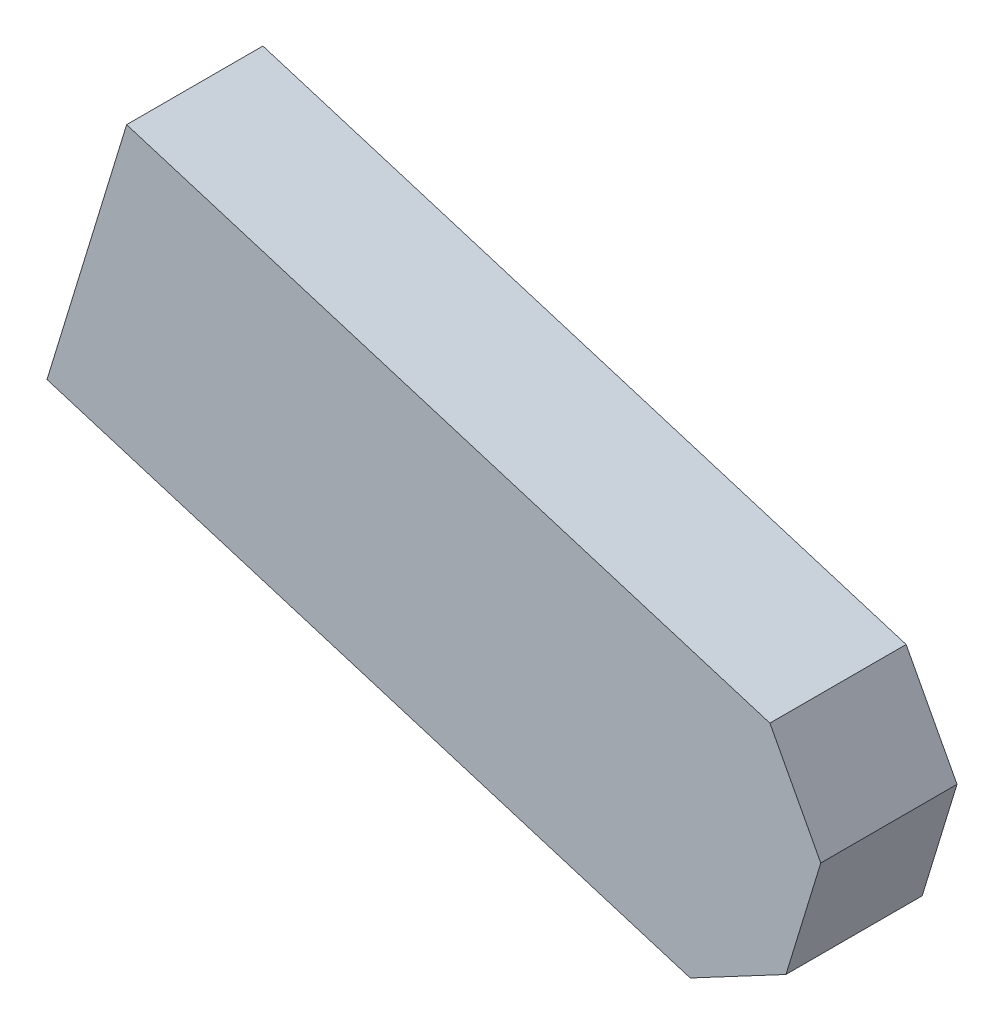
ISO-10303-21;
HEADER;
FILE_DESCRIPTION(('STEP AP214'),'2;1');
FILE_NAME('part.step','',(''),(''),'','','');
FILE_SCHEMA(('AUTOMOTIVE_DESIGN { 1 0 10303 214 1 1 1 1 }'));
ENDSEC;
DATA;
#1=APPLICATION_CONTEXT('core data for automotive mechanical design processes');
#2=APPLICATION_PROTOCOL_DEFINITION('international standard','automotive_design',2000,#1);
#3=PRODUCT_CONTEXT('',#1,'mechanical');
#4=PRODUCT('Part','Part','',(#3));
#5=PRODUCT_RELATED_PRODUCT_CATEGORY('part','',(#4));
#6=PRODUCT_DEFINITION_FORMATION('','',#4);
#7=PRODUCT_DEFINITION_CONTEXT('part definition',#1,'design');
#8=PRODUCT_DEFINITION('design','',#6,#7);
#9=PRODUCT_DEFINITION_SHAPE('','',#8);
#10=(LENGTH_UNIT() NAMED_UNIT(*) SI_UNIT(.MILLI.,.METRE.));
#11=(NAMED_UNIT(*) PLANE_ANGLE_UNIT() SI_UNIT($,.RADIAN.));
#12=(NAMED_UNIT(*) SI_UNIT($,.STERADIAN.) SOLID_ANGLE_UNIT());
#13=UNCERTAINTY_MEASURE_WITH_UNIT(LENGTH_MEASURE(1.E-05),#10,'distance_accuracy_value','');
#14=(GEOMETRIC_REPRESENTATION_CONTEXT(3) GLOBAL_UNCERTAINTY_ASSIGNED_CONTEXT((#13)) GLOBAL_UNIT_ASSIGNED_CONTEXT((#10,
#11,#12)) REPRESENTATION_CONTEXT('',''));
#15=CARTESIAN_POINT('',(0.,0.,0.));
#16=DIRECTION('',(0.,0.,1.));
#17=DIRECTION('',(1.,0.,0.));
#18=AXIS2_PLACEMENT_3D('',#15,#16,#17);
#19=CARTESIAN_POINT('',(-101.950033016076,47.9003211725232,185.));
#20=DIRECTION('',(-0.292371704722769,-0.956304755963026,0.));
#21=DIRECTION('',(-0.956304755963026,0.292371704722769,0.));
#22=AXIS2_PLACEMENT_3D('',#19,#20,#21);
#23=PLANE('',#22);
#24=DIRECTION('',(0.956304755963026,-0.292371704722769,0.));
#25=VECTOR('',#24,1.);
#26=CARTESIAN_POINT('',(-101.950033016076,47.9003211725232,201.));
#27=LINE('',#26,#25);
#28=CARTESIAN_POINT('',(-101.950033016076,47.9003211725231,201.));
#29=VERTEX_POINT('',#28);
#30=CARTESIAN_POINT('',(-26.4019572949981,24.8029564994249,201.));
#31=VERTEX_POINT('',#30);
#32=EDGE_CURVE('E133',#29,#31,#27,.T.);
#33=ORIENTED_EDGE('',*,*,#32,.T.);
#34=DIRECTION('',(0.,0.,1.));
#35=VECTOR('',#34,1.);
#36=CARTESIAN_POINT('',(-26.4019572949981,24.8029564994249,185.));
#37=LINE('',#36,#35);
#38=CARTESIAN_POINT('',(-26.4019572949981,24.8029564994249,185.));
#39=VERTEX_POINT('',#38);
#40=EDGE_CURVE('E11',#39,#31,#37,.T.);
#41=ORIENTED_EDGE('',*,*,#40,.F.);
#42=DIRECTION('',(0.956304755963026,-0.292371704722769,0.));
#43=VECTOR('',#42,1.);
#44=CARTESIAN_POINT('',(-101.950033016076,47.9003211725232,185.));
#45=LINE('',#44,#43);
#46=CARTESIAN_POINT('',(-101.950033016076,47.9003211725231,185.));
#47=VERTEX_POINT('',#46);
#48=EDGE_CURVE('E126',#47,#39,#45,.T.);
#49=ORIENTED_EDGE('',*,*,#48,.F.);
#50=DIRECTION('',(0.,0.,1.));
#51=VECTOR('',#50,1.);
#52=CARTESIAN_POINT('',(-101.950033016076,47.9003211725231,185.));
#53=LINE('',#52,#51);
#54=EDGE_CURVE('E122',#47,#29,#53,.T.);
#55=ORIENTED_EDGE('',*,*,#54,.T.);
#56=EDGE_LOOP('',(#33,#41,#49,#55));
#57=FACE_BOUND('',#56,.T.);
#58=ADVANCED_FACE('F18',(#57),#23,.F.);
#59=CARTESIAN_POINT('',(-26.4019572949981,24.8029564994249,185.));
#60=DIRECTION('',(-0.882947592859036,-0.469471562785685,0.));
#61=DIRECTION('',(-0.469471562785685,0.882947592859036,0.));
#62=AXIS2_PLACEMENT_3D('',#59,#60,#61);
#63=PLANE('',#62);
#64=DIRECTION('',(0.469471562785685,-0.882947592859036,0.));
#65=VECTOR('',#64,1.);
#66=CARTESIAN_POINT('',(-26.4019572949981,24.8029564994249,201.));
#67=LINE('',#66,#65);
#68=CARTESIAN_POINT('',(-20.4265598338377,13.5648683532511,201.));
#69=VERTEX_POINT('',#68);
#70=EDGE_CURVE('E129',#31,#69,#67,.T.);
#71=ORIENTED_EDGE('',*,*,#70,.T.);
#72=DIRECTION('',(0.,0.,1.));
#73=VECTOR('',#72,1.);
#74=CARTESIAN_POINT('',(-20.4265598338378,13.5648683532511,185.));
#75=LINE('',#74,#73);
#76=CARTESIAN_POINT('',(-20.4265598338378,13.5648683532511,185.));
#77=VERTEX_POINT('',#76);
#78=EDGE_CURVE('E27',#77,#69,#75,.T.);
#79=ORIENTED_EDGE('',*,*,#78,.F.);
#80=DIRECTION('',(0.469471562785685,-0.882947592859036,0.));
#81=VECTOR('',#80,1.);
#82=CARTESIAN_POINT('',(-26.4019572949981,24.8029564994249,185.));
#83=LINE('',#82,#81);
#84=EDGE_CURVE('E87',#39,#77,#83,.T.);
#85=ORIENTED_EDGE('',*,*,#84,.F.);
#86=ORIENTED_EDGE('',*,*,#40,.T.);
#87=EDGE_LOOP('',(#71,#79,#85,#86));
#88=FACE_BOUND('',#87,.T.);
#89=ADVANCED_FACE('F173',(#88),#63,.F.);
#90=CARTESIAN_POINT('',(-20.4265598338378,13.5648683532511,185.));
#91=DIRECTION('',(-0.956304755962999,0.292371704722856,0.));
#92=DIRECTION('',(0.292371704722856,0.956304755962999,0.));
#93=AXIS2_PLACEMENT_3D('',#90,#91,#92);
#94=PLANE('',#93);
#95=DIRECTION('',(-0.292371704722855,-0.956304755962999,0.));
#96=VECTOR('',#95,1.);
#97=CARTESIAN_POINT('',(-20.4265598338378,13.5648683532511,201.));
#98=LINE('',#97,#96);
#99=CARTESIAN_POINT('',(-24.5197636999577,0.176601769768997,201.));
#100=VERTEX_POINT('',#99);
#101=EDGE_CURVE('E132',#69,#100,#98,.T.);
#102=ORIENTED_EDGE('',*,*,#101,.T.);
#103=DIRECTION('',(0.,0.,1.));
#104=VECTOR('',#103,1.);
#105=CARTESIAN_POINT('',(-24.5197636999577,0.176601769769,185.));
#106=LINE('',#105,#104);
#107=CARTESIAN_POINT('',(-24.5197636999577,0.176601769769,185.));
#108=VERTEX_POINT('',#107);
#109=EDGE_CURVE('E114',#108,#100,#106,.T.);
#110=ORIENTED_EDGE('',*,*,#109,.F.);
#111=DIRECTION('',(-0.292371704722855,-0.956304755962999,0.));
#112=VECTOR('',#111,1.);
#113=CARTESIAN_POINT('',(-20.4265598338378,13.5648683532511,185.));
#114=LINE('',#113,#112);
#115=EDGE_CURVE('E103',#77,#108,#114,.T.);
#116=ORIENTED_EDGE('',*,*,#115,.F.);
#117=ORIENTED_EDGE('',*,*,#78,.T.);
#118=EDGE_LOOP('',(#102,#110,#116,#117));
#119=FACE_BOUND('',#118,.T.);
#120=ADVANCED_FACE('F154',(#119),#94,.F.);
#121=CARTESIAN_POINT('',(-24.5197636999577,0.176601769769,185.));
#122=DIRECTION('',(-0.469471562785981,0.882947592858879,0.));
#123=DIRECTION('',(0.882947592858879,0.469471562785981,0.));
#124=AXIS2_PLACEMENT_3D('',#121,#122,#123);
#125=PLANE('',#124);
#126=DIRECTION('',(-0.882947592858879,-0.469471562785981,0.));
#127=VECTOR('',#126,1.);
#128=CARTESIAN_POINT('',(-24.5197636999577,0.176601769768997,201.));
#129=LINE('',#128,#127);
#130=CARTESIAN_POINT('',(-35.7578518461286,-5.79879569139457,201.));
#131=VERTEX_POINT('',#130);
#132=EDGE_CURVE('E112',#100,#131,#129,.T.);
#133=ORIENTED_EDGE('',*,*,#132,.T.);
#134=DIRECTION('',(0.,0.,1.));
#135=VECTOR('',#134,1.);
#136=CARTESIAN_POINT('',(-35.7578518461286,-5.79879569139457,185.));
#137=LINE('',#136,#135);
#138=CARTESIAN_POINT('',(-35.7578518461286,-5.79879569139457,185.));
#139=VERTEX_POINT('',#138);
#140=EDGE_CURVE('E109',#139,#131,#137,.T.);
#141=ORIENTED_EDGE('',*,*,#140,.F.);
#142=DIRECTION('',(-0.882947592858879,-0.469471562785981,0.));
#143=VECTOR('',#142,1.);
#144=CARTESIAN_POINT('',(-24.5197636999577,0.176601769769,185.));
#145=LINE('',#144,#143);
#146=EDGE_CURVE('E97',#108,#139,#145,.T.);
#147=ORIENTED_EDGE('',*,*,#146,.F.);
#148=ORIENTED_EDGE('',*,*,#109,.T.);
#149=EDGE_LOOP('',(#133,#141,#147,#148));
#150=FACE_BOUND('',#149,.T.);
#151=ADVANCED_FACE('F110',(#150),#125,.F.);
#152=CARTESIAN_POINT('',(-35.7578518461286,-5.79879569139462,185.));
#153=DIRECTION('',(0.292371704722769,0.956304755963026,0.));
#154=DIRECTION('',(0.956304755963026,-0.292371704722769,0.));
#155=AXIS2_PLACEMENT_3D('',#152,#153,#154);
#156=PLANE('',#155);
#157=DIRECTION('',(-0.956304755963025,0.292371704722769,0.));
#158=VECTOR('',#157,1.);
#159=CARTESIAN_POINT('',(-35.7578518461286,-5.79879569139462,201.));
#160=LINE('',#159,#158);
#161=CARTESIAN_POINT('',(-111.305927567205,17.2985689817035,201.));
#162=VERTEX_POINT('',#161);
#163=EDGE_CURVE('E69',#131,#162,#160,.T.);
#164=ORIENTED_EDGE('',*,*,#163,.T.);
#165=DIRECTION('',(0.,0.,1.));
#166=VECTOR('',#165,1.);
#167=CARTESIAN_POINT('',(-111.305927567205,17.2985689817035,185.));
#168=LINE('',#167,#166);
#169=CARTESIAN_POINT('',(-111.305927567205,17.2985689817035,185.));
#170=VERTEX_POINT('',#169);
#171=EDGE_CURVE('E115',#170,#162,#168,.T.);
#172=ORIENTED_EDGE('',*,*,#171,.F.);
#173=DIRECTION('',(-0.956304755963025,0.292371704722769,0.));
#174=VECTOR('',#173,1.);
#175=CARTESIAN_POINT('',(-35.7578518461286,-5.79879569139462,185.));
#176=LINE('',#175,#174);
#177=EDGE_CURVE('E101',#139,#170,#176,.T.);
#178=ORIENTED_EDGE('',*,*,#177,.F.);
#179=ORIENTED_EDGE('',*,*,#140,.T.);
#180=EDGE_LOOP('',(#164,#172,#178,#179));
#181=FACE_BOUND('',#180,.T.);
#182=ADVANCED_FACE('F117',(#181),#156,.F.);
#183=CARTESIAN_POINT('',(-111.305927567205,17.2985689817035,185.));
#184=DIRECTION('',(0.956304755963022,-0.292371704722781,0.));
#185=DIRECTION('',(-0.292371704722781,-0.956304755963022,0.));
#186=AXIS2_PLACEMENT_3D('',#183,#184,#185);
#187=PLANE('',#186);
#188=DIRECTION('',(0.292371704722781,0.956304755963022,0.));
#189=VECTOR('',#188,1.);
#190=CARTESIAN_POINT('',(-111.305927567205,17.2985689817035,201.));
#191=LINE('',#190,#189);
#192=EDGE_CURVE('E77',#162,#29,#191,.T.);
#193=ORIENTED_EDGE('',*,*,#192,.T.);
#194=ORIENTED_EDGE('',*,*,#54,.F.);
#195=DIRECTION('',(0.292371704722781,0.956304755963022,0.));
#196=VECTOR('',#195,1.);
#197=CARTESIAN_POINT('',(-111.305927567205,17.2985689817035,185.));
#198=LINE('',#197,#196);
#199=EDGE_CURVE('E39',#170,#47,#198,.T.);
#200=ORIENTED_EDGE('',*,*,#199,.F.);
#201=ORIENTED_EDGE('',*,*,#171,.T.);
#202=EDGE_LOOP('',(#193,#194,#200,#201));
#203=FACE_BOUND('',#202,.T.);
#204=ADVANCED_FACE('F161',(#203),#187,.F.);
#205=CARTESIAN_POINT('',(-17.7952144913314,22.1716111569201,185.));
#206=DIRECTION('',(0.,0.,-1.));
#207=DIRECTION('',(0.882947592859036,0.469471562785685,0.));
#208=AXIS2_PLACEMENT_3D('',#205,#206,#207);
#209=PLANE('',#208);
#210=ORIENTED_EDGE('',*,*,#48,.T.);
#211=ORIENTED_EDGE('',*,*,#84,.T.);
#212=ORIENTED_EDGE('',*,*,#115,.T.);
#213=ORIENTED_EDGE('',*,*,#146,.T.);
#214=ORIENTED_EDGE('',*,*,#177,.T.);
#215=ORIENTED_EDGE('',*,*,#199,.T.);
#216=EDGE_LOOP('',(#210,#211,#212,#213,#214,#215));
#217=FACE_BOUND('',#216,.T.);
#218=ADVANCED_FACE('F99',(#217),#209,.T.);
#219=CARTESIAN_POINT('',(-17.7952144913314,22.1716111569201,201.));
#220=DIRECTION('',(0.,0.,-1.));
#221=DIRECTION('',(0.882947592859036,0.469471562785685,0.));
#222=AXIS2_PLACEMENT_3D('',#219,#220,#221);
#223=PLANE('',#222);
#224=ORIENTED_EDGE('',*,*,#32,.F.);
#225=ORIENTED_EDGE('',*,*,#192,.F.);
#226=ORIENTED_EDGE('',*,*,#163,.F.);
#227=ORIENTED_EDGE('',*,*,#132,.F.);
#228=ORIENTED_EDGE('',*,*,#101,.F.);
#229=ORIENTED_EDGE('',*,*,#70,.F.);
#230=EDGE_LOOP('',(#224,#225,#226,#227,#228,#229));
#231=FACE_BOUND('',#230,.T.);
#232=ADVANCED_FACE('F157',(#231),#223,.F.);
#233=CLOSED_SHELL('',(#58,#89,#120,#151,#182,#204,#218,#232));
#234=MANIFOLD_SOLID_BREP('B1',#233);
#235=ADVANCED_BREP_SHAPE_REPRESENTATION('',(#18,#234),#14);
#236=SHAPE_DEFINITION_REPRESENTATION(#9,#235);
ENDSEC;
END-ISO-10303-21;
